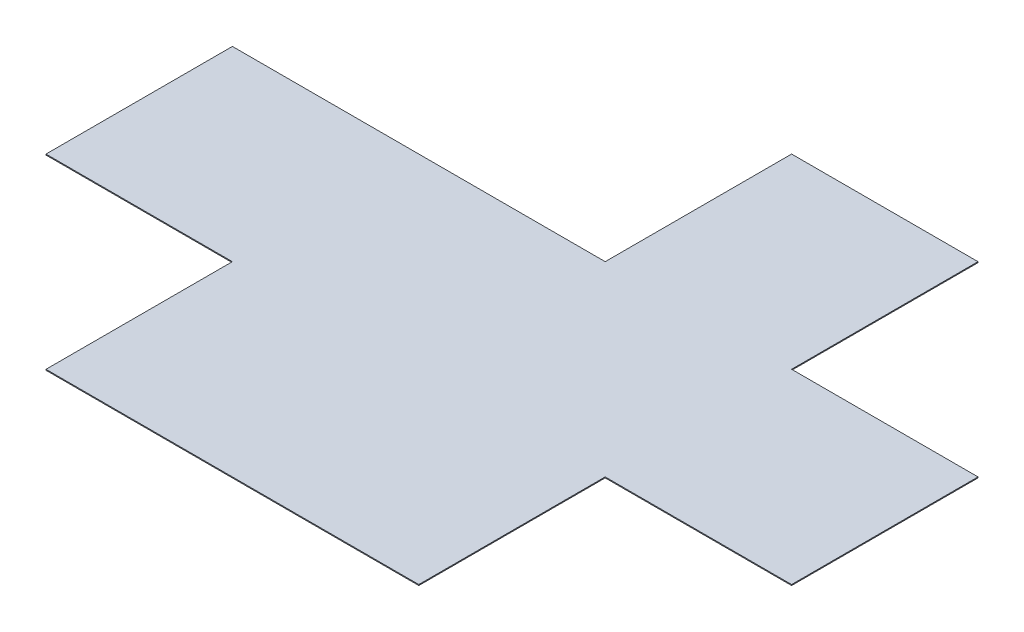
ISO-10303-21;
HEADER;
FILE_DESCRIPTION(('STEP AP214'),'2;1');
FILE_NAME('part.step','',(''),(''),'','','');
FILE_SCHEMA(('AUTOMOTIVE_DESIGN { 1 0 10303 214 1 1 1 1 }'));
ENDSEC;
DATA;
#1=APPLICATION_CONTEXT('core data for automotive mechanical design processes');
#2=APPLICATION_PROTOCOL_DEFINITION('international standard','automotive_design',2000,#1);
#3=PRODUCT_CONTEXT('',#1,'mechanical');
#4=PRODUCT('Part','Part','',(#3));
#5=PRODUCT_RELATED_PRODUCT_CATEGORY('part','',(#4));
#6=PRODUCT_DEFINITION_FORMATION('','',#4);
#7=PRODUCT_DEFINITION_CONTEXT('part definition',#1,'design');
#8=PRODUCT_DEFINITION('design','',#6,#7);
#9=PRODUCT_DEFINITION_SHAPE('','',#8);
#10=(LENGTH_UNIT() NAMED_UNIT(*) SI_UNIT(.MILLI.,.METRE.));
#11=(NAMED_UNIT(*) PLANE_ANGLE_UNIT() SI_UNIT($,.RADIAN.));
#12=(NAMED_UNIT(*) SI_UNIT($,.STERADIAN.) SOLID_ANGLE_UNIT());
#13=UNCERTAINTY_MEASURE_WITH_UNIT(LENGTH_MEASURE(1.E-05),#10,'distance_accuracy_value','');
#14=(GEOMETRIC_REPRESENTATION_CONTEXT(3) GLOBAL_UNCERTAINTY_ASSIGNED_CONTEXT((#13)) GLOBAL_UNIT_ASSIGNED_CONTEXT((#10,
#11,#12)) REPRESENTATION_CONTEXT('',''));
#15=CARTESIAN_POINT('',(0.,0.,0.));
#16=DIRECTION('',(0.,0.,1.));
#17=DIRECTION('',(1.,0.,0.));
#18=AXIS2_PLACEMENT_3D('',#15,#16,#17);
#19=CARTESIAN_POINT('',(3.77318429210848,2.601,2.2090830876138E-13));
#20=DIRECTION('',(1.,0.,0.));
#21=DIRECTION('',(0.,0.,-1.));
#22=AXIS2_PLACEMENT_3D('',#19,#20,#21);
#23=PLANE('',#22);
#24=DIRECTION('',(0.,0.,1.));
#25=VECTOR('',#24,1.);
#26=CARTESIAN_POINT('',(3.77318429210848,2.6,2.2090830876138E-13));
#27=LINE('',#26,#25);
#28=CARTESIAN_POINT('',(3.77318429210841,2.6,1.11907068929163));
#29=VERTEX_POINT('',#28);
#30=CARTESIAN_POINT('',(3.77318429210841,2.6,1.31907068929163));
#31=VERTEX_POINT('',#30);
#32=EDGE_CURVE('E11',#29,#31,#27,.T.);
#33=ORIENTED_EDGE('',*,*,#32,.F.);
#34=DIRECTION('',(0.,-1.,0.));
#35=VECTOR('',#34,1.);
#36=CARTESIAN_POINT('',(3.77318429210841,2.601,1.11907068929163));
#37=LINE('',#36,#35);
#38=CARTESIAN_POINT('',(3.77318429210841,2.601,1.11907068929163));
#39=VERTEX_POINT('',#38);
#40=EDGE_CURVE('E24',#39,#29,#37,.T.);
#41=ORIENTED_EDGE('',*,*,#40,.F.);
#42=DIRECTION('',(0.,0.,1.));
#43=VECTOR('',#42,1.);
#44=CARTESIAN_POINT('',(3.77318429210848,2.601,2.2090830876138E-13));
#45=LINE('',#44,#43);
#46=CARTESIAN_POINT('',(3.77318429210841,2.601,1.31907068929163));
#47=VERTEX_POINT('',#46);
#48=EDGE_CURVE('E205',#39,#47,#45,.T.);
#49=ORIENTED_EDGE('',*,*,#48,.T.);
#50=DIRECTION('',(0.,-1.,0.));
#51=VECTOR('',#50,1.);
#52=CARTESIAN_POINT('',(3.77318429210841,2.601,1.31907068929163));
#53=LINE('',#52,#51);
#54=EDGE_CURVE('E126',#47,#31,#53,.T.);
#55=ORIENTED_EDGE('',*,*,#54,.T.);
#56=EDGE_LOOP('',(#33,#41,#49,#55));
#57=FACE_BOUND('',#56,.T.);
#58=ADVANCED_FACE('F17',(#57),#23,.T.);
#59=CARTESIAN_POINT('',(0.,2.601,1.11907068929163));
#60=DIRECTION('',(0.,0.,-1.));
#61=DIRECTION('',(-1.,0.,0.));
#62=AXIS2_PLACEMENT_3D('',#59,#60,#61);
#63=PLANE('',#62);
#64=DIRECTION('',(1.,0.,0.));
#65=VECTOR('',#64,1.);
#66=CARTESIAN_POINT('',(0.,2.6,1.11907068929163));
#67=LINE('',#66,#65);
#68=CARTESIAN_POINT('',(3.97318429210806,2.6,1.11907068929163));
#69=VERTEX_POINT('',#68);
#70=EDGE_CURVE('E202',#29,#69,#67,.T.);
#71=ORIENTED_EDGE('',*,*,#70,.T.);
#72=DIRECTION('',(0.,-1.,0.));
#73=VECTOR('',#72,1.);
#74=CARTESIAN_POINT('',(3.97318429210806,2.601,1.11907068929163));
#75=LINE('',#74,#73);
#76=CARTESIAN_POINT('',(3.97318429210806,2.601,1.11907068929163));
#77=VERTEX_POINT('',#76);
#78=EDGE_CURVE('E199',#77,#69,#75,.T.);
#79=ORIENTED_EDGE('',*,*,#78,.F.);
#80=DIRECTION('',(1.,0.,0.));
#81=VECTOR('',#80,1.);
#82=CARTESIAN_POINT('',(0.,2.601,1.11907068929163));
#83=LINE('',#82,#81);
#84=EDGE_CURVE('E196',#39,#77,#83,.T.);
#85=ORIENTED_EDGE('',*,*,#84,.F.);
#86=ORIENTED_EDGE('',*,*,#40,.T.);
#87=EDGE_LOOP('',(#71,#79,#85,#86));
#88=FACE_BOUND('',#87,.T.);
#89=ADVANCED_FACE('F208',(#88),#63,.F.);
#90=CARTESIAN_POINT('',(3.97318429210813,2.601,2.41233162306581E-13));
#91=DIRECTION('',(1.,0.,0.));
#92=DIRECTION('',(0.,0.,-1.));
#93=AXIS2_PLACEMENT_3D('',#90,#91,#92);
#94=PLANE('',#93);
#95=DIRECTION('',(0.,0.,1.));
#96=VECTOR('',#95,1.);
#97=CARTESIAN_POINT('',(3.97318429210813,2.6,2.41233162306581E-13));
#98=LINE('',#97,#96);
#99=CARTESIAN_POINT('',(3.97318429210807,2.6,0.919070689291635));
#100=VERTEX_POINT('',#99);
#101=EDGE_CURVE('E193',#100,#69,#98,.T.);
#102=ORIENTED_EDGE('',*,*,#101,.F.);
#103=DIRECTION('',(0.,-1.,0.));
#104=VECTOR('',#103,1.);
#105=CARTESIAN_POINT('',(3.97318429210807,2.601,0.919070689291635));
#106=LINE('',#105,#104);
#107=CARTESIAN_POINT('',(3.97318429210807,2.601,0.919070689291635));
#108=VERTEX_POINT('',#107);
#109=EDGE_CURVE('E190',#108,#100,#106,.T.);
#110=ORIENTED_EDGE('',*,*,#109,.F.);
#111=DIRECTION('',(0.,0.,1.));
#112=VECTOR('',#111,1.);
#113=CARTESIAN_POINT('',(3.97318429210813,2.601,2.41233162306581E-13));
#114=LINE('',#113,#112);
#115=EDGE_CURVE('E187',#108,#77,#114,.T.);
#116=ORIENTED_EDGE('',*,*,#115,.T.);
#117=ORIENTED_EDGE('',*,*,#78,.T.);
#118=EDGE_LOOP('',(#102,#110,#116,#117));
#119=FACE_BOUND('',#118,.T.);
#120=ADVANCED_FACE('F211',(#119),#94,.T.);
#121=CARTESIAN_POINT('',(0.,2.601,0.919070689291637));
#122=DIRECTION('',(0.,0.,-1.));
#123=DIRECTION('',(-1.,0.,0.));
#124=AXIS2_PLACEMENT_3D('',#121,#122,#123);
#125=PLANE('',#124);
#126=DIRECTION('',(1.,0.,0.));
#127=VECTOR('',#126,1.);
#128=CARTESIAN_POINT('',(0.,2.6,0.919070689291637));
#129=LINE('',#128,#127);
#130=CARTESIAN_POINT('',(3.77318429210841,2.6,0.919070689291635));
#131=VERTEX_POINT('',#130);
#132=EDGE_CURVE('E184',#131,#100,#129,.T.);
#133=ORIENTED_EDGE('',*,*,#132,.F.);
#134=DIRECTION('',(0.,-1.,0.));
#135=VECTOR('',#134,1.);
#136=CARTESIAN_POINT('',(3.77318429210841,2.601,0.919070689291635));
#137=LINE('',#136,#135);
#138=CARTESIAN_POINT('',(3.77318429210841,2.601,0.919070689291635));
#139=VERTEX_POINT('',#138);
#140=EDGE_CURVE('E181',#139,#131,#137,.T.);
#141=ORIENTED_EDGE('',*,*,#140,.F.);
#142=DIRECTION('',(1.,0.,0.));
#143=VECTOR('',#142,1.);
#144=CARTESIAN_POINT('',(0.,2.601,0.919070689291637));
#145=LINE('',#144,#143);
#146=EDGE_CURVE('E178',#139,#108,#145,.T.);
#147=ORIENTED_EDGE('',*,*,#146,.T.);
#148=ORIENTED_EDGE('',*,*,#109,.T.);
#149=EDGE_LOOP('',(#133,#141,#147,#148));
#150=FACE_BOUND('',#149,.T.);
#151=ADVANCED_FACE('F214',(#150),#125,.T.);
#152=CARTESIAN_POINT('',(3.77318429210846,2.601,2.20908308761379E-13));
#153=DIRECTION('',(1.,0.,0.));
#154=DIRECTION('',(0.,0.,-1.));
#155=AXIS2_PLACEMENT_3D('',#152,#153,#154);
#156=PLANE('',#155);
#157=DIRECTION('',(0.,0.,1.));
#158=VECTOR('',#157,1.);
#159=CARTESIAN_POINT('',(3.77318429210846,2.6,2.20908308761379E-13));
#160=LINE('',#159,#158);
#161=CARTESIAN_POINT('',(3.77318429210841,2.6,0.719070689291636));
#162=VERTEX_POINT('',#161);
#163=EDGE_CURVE('E175',#162,#131,#160,.T.);
#164=ORIENTED_EDGE('',*,*,#163,.F.);
#165=DIRECTION('',(0.,-1.,0.));
#166=VECTOR('',#165,1.);
#167=CARTESIAN_POINT('',(3.77318429210841,2.601,0.719070689291636));
#168=LINE('',#167,#166);
#169=CARTESIAN_POINT('',(3.77318429210841,2.601,0.719070689291636));
#170=VERTEX_POINT('',#169);
#171=EDGE_CURVE('E172',#170,#162,#168,.T.);
#172=ORIENTED_EDGE('',*,*,#171,.F.);
#173=DIRECTION('',(0.,0.,1.));
#174=VECTOR('',#173,1.);
#175=CARTESIAN_POINT('',(3.77318429210846,2.601,2.20908308761379E-13));
#176=LINE('',#175,#174);
#177=EDGE_CURVE('E169',#170,#139,#176,.T.);
#178=ORIENTED_EDGE('',*,*,#177,.T.);
#179=ORIENTED_EDGE('',*,*,#140,.T.);
#180=EDGE_LOOP('',(#164,#172,#178,#179));
#181=FACE_BOUND('',#180,.T.);
#182=ADVANCED_FACE('F219',(#181),#156,.T.);
#183=CARTESIAN_POINT('',(0.,2.601,0.719070689291636));
#184=DIRECTION('',(0.,0.,-1.));
#185=DIRECTION('',(-1.,0.,0.));
#186=AXIS2_PLACEMENT_3D('',#183,#184,#185);
#187=PLANE('',#186);
#188=DIRECTION('',(1.,0.,0.));
#189=VECTOR('',#188,1.);
#190=CARTESIAN_POINT('',(0.,2.6,0.719070689291636));
#191=LINE('',#190,#189);
#192=CARTESIAN_POINT('',(3.57318429210876,2.6,0.719070689291636));
#193=VERTEX_POINT('',#192);
#194=EDGE_CURVE('E166',#193,#162,#191,.T.);
#195=ORIENTED_EDGE('',*,*,#194,.F.);
#196=DIRECTION('',(0.,-1.,0.));
#197=VECTOR('',#196,1.);
#198=CARTESIAN_POINT('',(3.57318429210876,2.601,0.719070689291636));
#199=LINE('',#198,#197);
#200=CARTESIAN_POINT('',(3.57318429210876,2.601,0.719070689291636));
#201=VERTEX_POINT('',#200);
#202=EDGE_CURVE('E163',#201,#193,#199,.T.);
#203=ORIENTED_EDGE('',*,*,#202,.F.);
#204=DIRECTION('',(1.,0.,0.));
#205=VECTOR('',#204,1.);
#206=CARTESIAN_POINT('',(0.,2.601,0.719070689291636));
#207=LINE('',#206,#205);
#208=EDGE_CURVE('E160',#201,#170,#207,.T.);
#209=ORIENTED_EDGE('',*,*,#208,.T.);
#210=ORIENTED_EDGE('',*,*,#171,.T.);
#211=EDGE_LOOP('',(#195,#203,#209,#210));
#212=FACE_BOUND('',#211,.T.);
#213=ADVANCED_FACE('F221',(#212),#187,.T.);
#214=CARTESIAN_POINT('',(3.5731842921088,2.601,2.16947033642947E-13));
#215=DIRECTION('',(1.,0.,0.));
#216=DIRECTION('',(0.,0.,-1.));
#217=AXIS2_PLACEMENT_3D('',#214,#215,#216);
#218=PLANE('',#217);
#219=DIRECTION('',(0.,0.,1.));
#220=VECTOR('',#219,1.);
#221=CARTESIAN_POINT('',(3.5731842921088,2.6,2.16947033642947E-13));
#222=LINE('',#221,#220);
#223=CARTESIAN_POINT('',(3.57318429210874,2.6,0.919070689291635));
#224=VERTEX_POINT('',#223);
#225=EDGE_CURVE('E158',#193,#224,#222,.T.);
#226=ORIENTED_EDGE('',*,*,#225,.T.);
#227=DIRECTION('',(0.,-1.,0.));
#228=VECTOR('',#227,1.);
#229=CARTESIAN_POINT('',(3.57318429210874,2.601,0.919070689291635));
#230=LINE('',#229,#228);
#231=CARTESIAN_POINT('',(3.57318429210874,2.601,0.919070689291635));
#232=VERTEX_POINT('',#231);
#233=EDGE_CURVE('E155',#232,#224,#230,.T.);
#234=ORIENTED_EDGE('',*,*,#233,.F.);
#235=DIRECTION('',(0.,0.,1.));
#236=VECTOR('',#235,1.);
#237=CARTESIAN_POINT('',(3.5731842921088,2.601,2.16947033642947E-13));
#238=LINE('',#237,#236);
#239=EDGE_CURVE('E152',#201,#232,#238,.T.);
#240=ORIENTED_EDGE('',*,*,#239,.F.);
#241=ORIENTED_EDGE('',*,*,#202,.T.);
#242=EDGE_LOOP('',(#226,#234,#240,#241));
#243=FACE_BOUND('',#242,.T.);
#244=ADVANCED_FACE('F225',(#243),#218,.F.);
#245=CARTESIAN_POINT('',(0.,2.601,0.919070689291635));
#246=DIRECTION('',(0.,0.,-1.));
#247=DIRECTION('',(-1.,0.,0.));
#248=AXIS2_PLACEMENT_3D('',#245,#246,#247);
#249=PLANE('',#248);
#250=DIRECTION('',(1.,0.,0.));
#251=VECTOR('',#250,1.);
#252=CARTESIAN_POINT('',(0.,2.6,0.919070689291635));
#253=LINE('',#252,#251);
#254=CARTESIAN_POINT('',(3.17318429210944,2.6,0.919070689291635));
#255=VERTEX_POINT('',#254);
#256=EDGE_CURVE('E149',#255,#224,#253,.T.);
#257=ORIENTED_EDGE('',*,*,#256,.F.);
#258=DIRECTION('',(0.,-1.,0.));
#259=VECTOR('',#258,1.);
#260=CARTESIAN_POINT('',(3.17318429210944,2.601,0.919070689291635));
#261=LINE('',#260,#259);
#262=CARTESIAN_POINT('',(3.17318429210944,2.601,0.919070689291635));
#263=VERTEX_POINT('',#262);
#264=EDGE_CURVE('E146',#263,#255,#261,.T.);
#265=ORIENTED_EDGE('',*,*,#264,.F.);
#266=DIRECTION('',(1.,0.,0.));
#267=VECTOR('',#266,1.);
#268=CARTESIAN_POINT('',(0.,2.601,0.919070689291635));
#269=LINE('',#268,#267);
#270=EDGE_CURVE('E143',#263,#232,#269,.T.);
#271=ORIENTED_EDGE('',*,*,#270,.T.);
#272=ORIENTED_EDGE('',*,*,#233,.T.);
#273=EDGE_LOOP('',(#257,#265,#271,#272));
#274=FACE_BOUND('',#273,.T.);
#275=ADVANCED_FACE('F228',(#274),#249,.T.);
#276=CARTESIAN_POINT('',(3.17318429210944,2.601,0.));
#277=DIRECTION('',(1.,0.,0.));
#278=DIRECTION('',(0.,0.,-1.));
#279=AXIS2_PLACEMENT_3D('',#276,#277,#278);
#280=PLANE('',#279);
#281=DIRECTION('',(0.,0.,1.));
#282=VECTOR('',#281,1.);
#283=CARTESIAN_POINT('',(3.17318429210944,2.6,0.));
#284=LINE('',#283,#282);
#285=CARTESIAN_POINT('',(3.17318429210943,2.6,1.11907068929163));
#286=VERTEX_POINT('',#285);
#287=EDGE_CURVE('E141',#255,#286,#284,.T.);
#288=ORIENTED_EDGE('',*,*,#287,.T.);
#289=DIRECTION('',(0.,-1.,0.));
#290=VECTOR('',#289,1.);
#291=CARTESIAN_POINT('',(3.17318429210943,2.601,1.11907068929163));
#292=LINE('',#291,#290);
#293=CARTESIAN_POINT('',(3.17318429210943,2.601,1.11907068929163));
#294=VERTEX_POINT('',#293);
#295=EDGE_CURVE('E138',#294,#286,#292,.T.);
#296=ORIENTED_EDGE('',*,*,#295,.F.);
#297=DIRECTION('',(0.,0.,1.));
#298=VECTOR('',#297,1.);
#299=CARTESIAN_POINT('',(3.17318429210944,2.601,0.));
#300=LINE('',#299,#298);
#301=EDGE_CURVE('E136',#263,#294,#300,.T.);
#302=ORIENTED_EDGE('',*,*,#301,.F.);
#303=ORIENTED_EDGE('',*,*,#264,.T.);
#304=EDGE_LOOP('',(#288,#296,#302,#303));
#305=FACE_BOUND('',#304,.T.);
#306=ADVANCED_FACE('F232',(#305),#280,.F.);
#307=CARTESIAN_POINT('',(0.,2.601,1.11907068929163));
#308=DIRECTION('',(0.,0.,-1.));
#309=DIRECTION('',(-1.,0.,0.));
#310=AXIS2_PLACEMENT_3D('',#307,#308,#309);
#311=PLANE('',#310);
#312=DIRECTION('',(1.,0.,0.));
#313=VECTOR('',#312,1.);
#314=CARTESIAN_POINT('',(0.,2.6,1.11907068929163));
#315=LINE('',#314,#313);
#316=CARTESIAN_POINT('',(3.37318429210909,2.6,1.11907068929163));
#317=VERTEX_POINT('',#316);
#318=EDGE_CURVE('E134',#286,#317,#315,.T.);
#319=ORIENTED_EDGE('',*,*,#318,.T.);
#320=DIRECTION('',(0.,-1.,0.));
#321=VECTOR('',#320,1.);
#322=CARTESIAN_POINT('',(3.37318429210909,2.601,1.11907068929163));
#323=LINE('',#322,#321);
#324=CARTESIAN_POINT('',(3.37318429210909,2.601,1.11907068929163));
#325=VERTEX_POINT('',#324);
#326=EDGE_CURVE('E132',#325,#317,#323,.T.);
#327=ORIENTED_EDGE('',*,*,#326,.F.);
#328=DIRECTION('',(1.,0.,0.));
#329=VECTOR('',#328,1.);
#330=CARTESIAN_POINT('',(0.,2.601,1.11907068929163));
#331=LINE('',#330,#329);
#332=EDGE_CURVE('E121',#294,#325,#331,.T.);
#333=ORIENTED_EDGE('',*,*,#332,.F.);
#334=ORIENTED_EDGE('',*,*,#295,.T.);
#335=EDGE_LOOP('',(#319,#327,#333,#334));
#336=FACE_BOUND('',#335,.T.);
#337=ADVANCED_FACE('F235',(#336),#311,.F.);
#338=CARTESIAN_POINT('',(3.37318429210917,2.601,1.97489541835733E-13));
#339=DIRECTION('',(1.,0.,0.));
#340=DIRECTION('',(0.,0.,-1.));
#341=AXIS2_PLACEMENT_3D('',#338,#339,#340);
#342=PLANE('',#341);
#343=DIRECTION('',(0.,0.,1.));
#344=VECTOR('',#343,1.);
#345=CARTESIAN_POINT('',(3.37318429210917,2.6,1.97489541835733E-13));
#346=LINE('',#345,#344);
#347=CARTESIAN_POINT('',(3.37318429210909,2.6,1.31907068929163));
#348=VERTEX_POINT('',#347);
#349=EDGE_CURVE('E108',#317,#348,#346,.T.);
#350=ORIENTED_EDGE('',*,*,#349,.T.);
#351=DIRECTION('',(0.,-1.,0.));
#352=VECTOR('',#351,1.);
#353=CARTESIAN_POINT('',(3.37318429210909,2.601,1.31907068929163));
#354=LINE('',#353,#352);
#355=CARTESIAN_POINT('',(3.37318429210909,2.601,1.31907068929163));
#356=VERTEX_POINT('',#355);
#357=EDGE_CURVE('E102',#356,#348,#354,.T.);
#358=ORIENTED_EDGE('',*,*,#357,.F.);
#359=DIRECTION('',(0.,0.,1.));
#360=VECTOR('',#359,1.);
#361=CARTESIAN_POINT('',(3.37318429210917,2.601,1.97489541835733E-13));
#362=LINE('',#361,#360);
#363=EDGE_CURVE('E106',#325,#356,#362,.T.);
#364=ORIENTED_EDGE('',*,*,#363,.F.);
#365=ORIENTED_EDGE('',*,*,#326,.T.);
#366=EDGE_LOOP('',(#350,#358,#364,#365));
#367=FACE_BOUND('',#366,.T.);
#368=ADVANCED_FACE('F104',(#367),#342,.F.);
#369=CARTESIAN_POINT('',(0.,2.601,1.31907068929163));
#370=DIRECTION('',(0.,0.,-1.));
#371=DIRECTION('',(-1.,0.,0.));
#372=AXIS2_PLACEMENT_3D('',#369,#370,#371);
#373=PLANE('',#372);
#374=DIRECTION('',(1.,0.,0.));
#375=VECTOR('',#374,1.);
#376=CARTESIAN_POINT('',(0.,2.6,1.31907068929163));
#377=LINE('',#376,#375);
#378=EDGE_CURVE('E122',#348,#31,#377,.T.);
#379=ORIENTED_EDGE('',*,*,#378,.T.);
#380=ORIENTED_EDGE('',*,*,#54,.F.);
#381=DIRECTION('',(1.,0.,0.));
#382=VECTOR('',#381,1.);
#383=CARTESIAN_POINT('',(0.,2.601,1.31907068929163));
#384=LINE('',#383,#382);
#385=EDGE_CURVE('E118',#356,#47,#384,.T.);
#386=ORIENTED_EDGE('',*,*,#385,.F.);
#387=ORIENTED_EDGE('',*,*,#357,.T.);
#388=EDGE_LOOP('',(#379,#380,#386,#387));
#389=FACE_BOUND('',#388,.T.);
#390=ADVANCED_FACE('F125',(#389),#373,.F.);
#391=CARTESIAN_POINT('',(0.,2.601,0.));
#392=DIRECTION('',(0.,1.,0.));
#393=DIRECTION('',(0.,0.,1.));
#394=AXIS2_PLACEMENT_3D('',#391,#392,#393);
#395=PLANE('',#394);
#396=ORIENTED_EDGE('',*,*,#48,.F.);
#397=ORIENTED_EDGE('',*,*,#84,.T.);
#398=ORIENTED_EDGE('',*,*,#115,.F.);
#399=ORIENTED_EDGE('',*,*,#146,.F.);
#400=ORIENTED_EDGE('',*,*,#177,.F.);
#401=ORIENTED_EDGE('',*,*,#208,.F.);
#402=ORIENTED_EDGE('',*,*,#239,.T.);
#403=ORIENTED_EDGE('',*,*,#270,.F.);
#404=ORIENTED_EDGE('',*,*,#301,.T.);
#405=ORIENTED_EDGE('',*,*,#332,.T.);
#406=ORIENTED_EDGE('',*,*,#363,.T.);
#407=ORIENTED_EDGE('',*,*,#385,.T.);
#408=EDGE_LOOP('',(#396,#397,#398,#399,#400,#401,#402,#403,#404,#405,#406,#407));
#409=FACE_BOUND('',#408,.T.);
#410=ADVANCED_FACE('F117',(#409),#395,.T.);
#411=CARTESIAN_POINT('',(0.,2.6,0.));
#412=DIRECTION('',(0.,1.,0.));
#413=DIRECTION('',(0.,0.,1.));
#414=AXIS2_PLACEMENT_3D('',#411,#412,#413);
#415=PLANE('',#414);
#416=ORIENTED_EDGE('',*,*,#32,.T.);
#417=ORIENTED_EDGE('',*,*,#378,.F.);
#418=ORIENTED_EDGE('',*,*,#349,.F.);
#419=ORIENTED_EDGE('',*,*,#318,.F.);
#420=ORIENTED_EDGE('',*,*,#287,.F.);
#421=ORIENTED_EDGE('',*,*,#256,.T.);
#422=ORIENTED_EDGE('',*,*,#225,.F.);
#423=ORIENTED_EDGE('',*,*,#194,.T.);
#424=ORIENTED_EDGE('',*,*,#163,.T.);
#425=ORIENTED_EDGE('',*,*,#132,.T.);
#426=ORIENTED_EDGE('',*,*,#101,.T.);
#427=ORIENTED_EDGE('',*,*,#70,.F.);
#428=EDGE_LOOP('',(#416,#417,#418,#419,#420,#421,#422,#423,#424,#425,#426,#427));
#429=FACE_BOUND('',#428,.T.);
#430=ADVANCED_FACE('F209',(#429),#415,.F.);
#431=CLOSED_SHELL('',(#58,#89,#120,#151,#182,#213,#244,#275,#306,#337,#368,#390,#410,#430));
#432=MANIFOLD_SOLID_BREP('B1',#431);
#433=ADVANCED_BREP_SHAPE_REPRESENTATION('',(#18,#432),#14);
#434=SHAPE_DEFINITION_REPRESENTATION(#9,#433);
ENDSEC;
END-ISO-10303-21;
